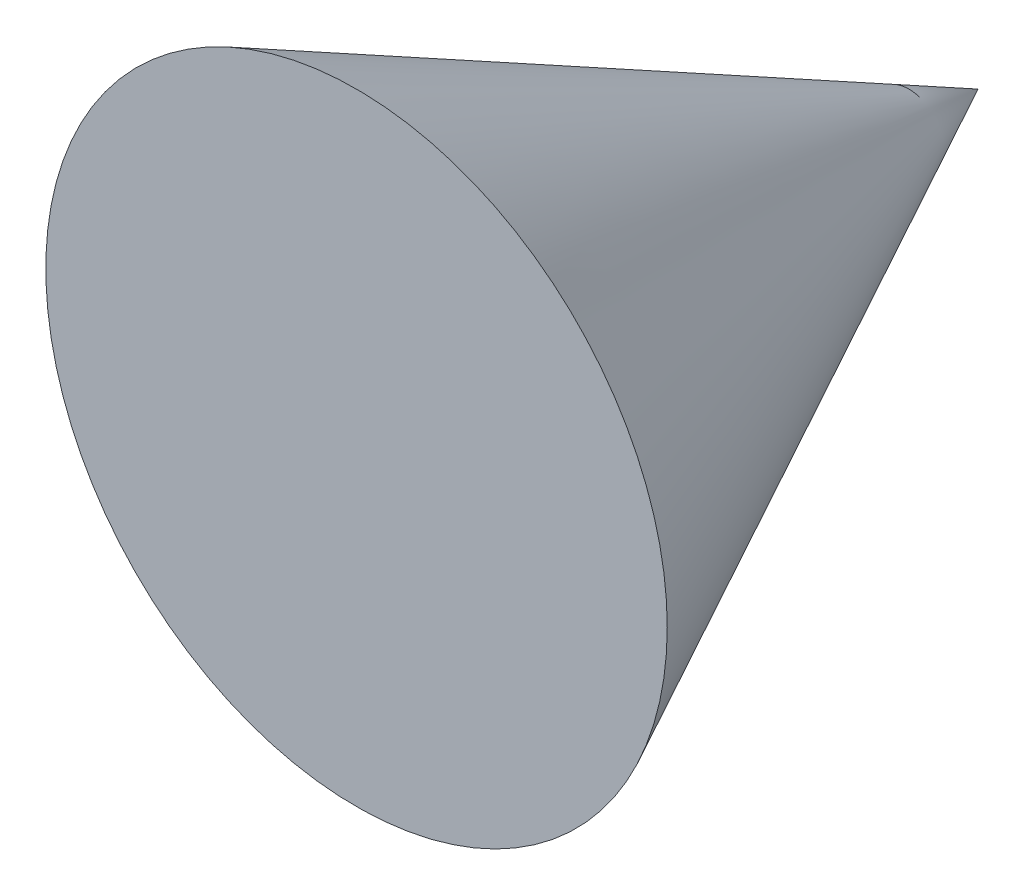
ISO-10303-21;
HEADER;
FILE_DESCRIPTION(('STEP AP214'),'2;1');
FILE_NAME('part.step','',(''),(''),'','','');
FILE_SCHEMA(('AUTOMOTIVE_DESIGN { 1 0 10303 214 1 1 1 1 }'));
ENDSEC;
DATA;
#1=APPLICATION_CONTEXT('core data for automotive mechanical design processes');
#2=APPLICATION_PROTOCOL_DEFINITION('international standard','automotive_design',2000,#1);
#3=PRODUCT_CONTEXT('',#1,'mechanical');
#4=PRODUCT('Part','Part','',(#3));
#5=PRODUCT_RELATED_PRODUCT_CATEGORY('part','',(#4));
#6=PRODUCT_DEFINITION_FORMATION('','',#4);
#7=PRODUCT_DEFINITION_CONTEXT('part definition',#1,'design');
#8=PRODUCT_DEFINITION('design','',#6,#7);
#9=PRODUCT_DEFINITION_SHAPE('','',#8);
#10=(LENGTH_UNIT() NAMED_UNIT(*) SI_UNIT(.MILLI.,.METRE.));
#11=(NAMED_UNIT(*) PLANE_ANGLE_UNIT() SI_UNIT($,.RADIAN.));
#12=(NAMED_UNIT(*) SI_UNIT($,.STERADIAN.) SOLID_ANGLE_UNIT());
#13=UNCERTAINTY_MEASURE_WITH_UNIT(LENGTH_MEASURE(1.E-05),#10,'distance_accuracy_value','');
#14=(GEOMETRIC_REPRESENTATION_CONTEXT(3) GLOBAL_UNCERTAINTY_ASSIGNED_CONTEXT((#13)) GLOBAL_UNIT_ASSIGNED_CONTEXT((#10,
#11,#12)) REPRESENTATION_CONTEXT('',''));
#15=CARTESIAN_POINT('',(0.,0.,0.));
#16=DIRECTION('',(0.,0.,1.));
#17=DIRECTION('',(1.,0.,0.));
#18=AXIS2_PLACEMENT_3D('',#15,#16,#17);
#19=CARTESIAN_POINT('',(0.,0.,0.));
#20=DIRECTION('',(0.,0.,1.));
#21=DIRECTION('',(1.,0.,0.));
#22=AXIS2_PLACEMENT_3D('',#19,#20,#21);
#23=PLANE('',#22);
#24=CARTESIAN_POINT('',(0.,0.,0.));
#25=DIRECTION('',(0.,0.,1.));
#26=DIRECTION('',(1.,0.,0.));
#27=AXIS2_PLACEMENT_3D('',#24,#25,#26);
#28=CIRCLE('',#27,100.);
#29=CARTESIAN_POINT('',(100.,0.,0.));
#30=VERTEX_POINT('',#29);
#31=EDGE_CURVE('E11',#30,#30,#28,.T.);
#32=ORIENTED_EDGE('',*,*,#31,.T.);
#33=EDGE_LOOP('',(#32));
#34=FACE_BOUND('',#33,.T.);
#35=ADVANCED_FACE('F41',(#34),#23,.T.);
#36=CARTESIAN_POINT('',(0.,0.,0.));
#37=DIRECTION('',(0.,0.,1.));
#38=DIRECTION('',(1.,0.,0.));
#39=AXIS2_PLACEMENT_3D('',#36,#37,#38);
#40=CONICAL_SURFACE('',#39,100.,0.463647609000806);
#41=CARTESIAN_POINT('',(0.,0.,-200.));
#42=VERTEX_POINT('',#41);
#43=VERTEX_LOOP('',#42);
#44=FACE_BOUND('',#43,.T.);
#45=ORIENTED_EDGE('',*,*,#31,.F.);
#46=EDGE_LOOP('',(#45));
#47=FACE_BOUND('',#46,.T.);
#48=ADVANCED_FACE('F48',(#44,#47),#40,.T.);
#49=CLOSED_SHELL('',(#35,#48));
#50=MANIFOLD_SOLID_BREP('B2',#49);
#51=ADVANCED_BREP_SHAPE_REPRESENTATION('',(#18,#50),#14);
#52=SHAPE_DEFINITION_REPRESENTATION(#9,#51);
ENDSEC;
END-ISO-10303-21;
